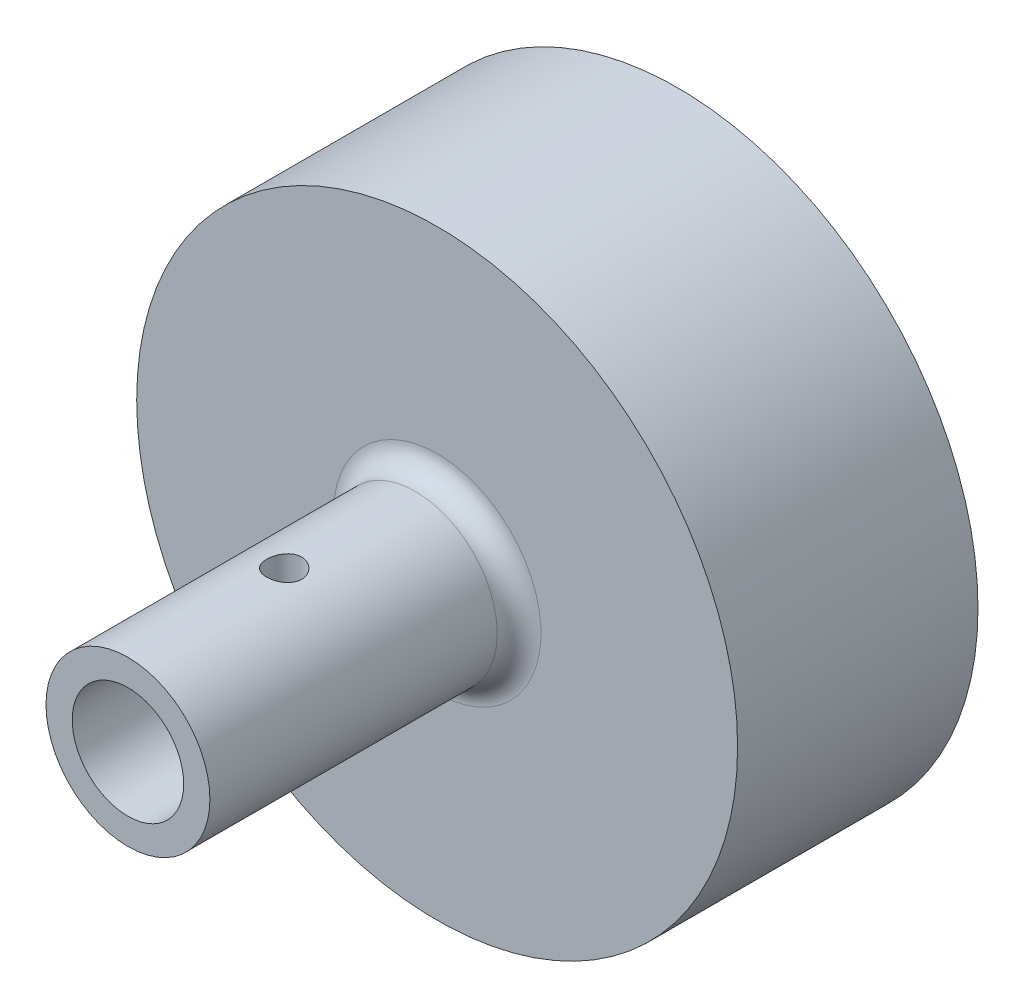
ISO-10303-21;
HEADER;
FILE_DESCRIPTION(('STEP AP214'),'2;1');
FILE_NAME('part.step','',(''),(''),'','','');
FILE_SCHEMA(('AUTOMOTIVE_DESIGN { 1 0 10303 214 1 1 1 1 }'));
ENDSEC;
DATA;
#1=APPLICATION_CONTEXT('core data for automotive mechanical design processes');
#2=APPLICATION_PROTOCOL_DEFINITION('international standard','automotive_design',2000,#1);
#3=PRODUCT_CONTEXT('',#1,'mechanical');
#4=PRODUCT('Part','Part','',(#3));
#5=PRODUCT_RELATED_PRODUCT_CATEGORY('part','',(#4));
#6=PRODUCT_DEFINITION_FORMATION('','',#4);
#7=PRODUCT_DEFINITION_CONTEXT('part definition',#1,'design');
#8=PRODUCT_DEFINITION('design','',#6,#7);
#9=PRODUCT_DEFINITION_SHAPE('','',#8);
#10=(LENGTH_UNIT() NAMED_UNIT(*) SI_UNIT(.MILLI.,.METRE.));
#11=(NAMED_UNIT(*) PLANE_ANGLE_UNIT() SI_UNIT($,.RADIAN.));
#12=(NAMED_UNIT(*) SI_UNIT($,.STERADIAN.) SOLID_ANGLE_UNIT());
#13=UNCERTAINTY_MEASURE_WITH_UNIT(LENGTH_MEASURE(1.E-05),#10,'distance_accuracy_value','');
#14=(GEOMETRIC_REPRESENTATION_CONTEXT(3) GLOBAL_UNCERTAINTY_ASSIGNED_CONTEXT((#13)) GLOBAL_UNIT_ASSIGNED_CONTEXT((#10,
#11,#12)) REPRESENTATION_CONTEXT('',''));
#15=CARTESIAN_POINT('',(0.,0.,0.));
#16=DIRECTION('',(0.,0.,1.));
#17=DIRECTION('',(1.,0.,0.));
#18=AXIS2_PLACEMENT_3D('',#15,#16,#17);
#19=CARTESIAN_POINT('',(0.,0.,28.3));
#20=DIRECTION('',(0.,0.,-1.));
#21=DIRECTION('',(-1.,0.,0.));
#22=AXIS2_PLACEMENT_3D('',#19,#20,#21);
#23=CYLINDRICAL_SURFACE('',#22,7.5);
#24=CARTESIAN_POINT('',(0.,0.,2.));
#25=DIRECTION('',(0.,0.,-1.));
#26=DIRECTION('',(-1.,0.,0.));
#27=AXIS2_PLACEMENT_3D('',#24,#25,#26);
#28=CIRCLE('',#27,7.5);
#29=CARTESIAN_POINT('',(-7.5,0.,2.));
#30=VERTEX_POINT('',#29);
#31=EDGE_CURVE('E57',#30,#30,#28,.F.);
#32=ORIENTED_EDGE('',*,*,#31,.T.);
#33=EDGE_LOOP('',(#32));
#34=FACE_BOUND('',#33,.T.);
#35=CARTESIAN_POINT('',(0.,0.,28.3));
#36=DIRECTION('',(0.,0.,1.));
#37=DIRECTION('',(1.,0.,0.));
#38=AXIS2_PLACEMENT_3D('',#35,#36,#37);
#39=CIRCLE('',#38,7.5);
#40=CARTESIAN_POINT('',(7.5,0.,28.3));
#41=VERTEX_POINT('',#40);
#42=EDGE_CURVE('E146',#41,#41,#39,.T.);
#43=ORIENTED_EDGE('',*,*,#42,.F.);
#44=EDGE_LOOP('',(#43));
#45=FACE_BOUND('',#44,.T.);
#46=CARTESIAN_POINT('',(0.,7.5,12.4));
#47=CARTESIAN_POINT('',(-0.0887944293338556,7.4999983570598,12.4000031058046));
#48=CARTESIAN_POINT('',(-0.177626889700681,7.49840703800838,12.4074166344796));
#49=CARTESIAN_POINT('',(-0.352772204992273,7.49221258982039,12.436846238572));
#50=CARTESIAN_POINT('',(-0.439083150622767,7.48760723719598,12.4588730945767));
#51=CARTESIAN_POINT('',(-0.60662858018066,7.47589793294748,12.5168109519539));
#52=CARTESIAN_POINT('',(-0.687868139445261,7.46879652810656,12.5527078051214));
#53=CARTESIAN_POINT('',(-0.843167757727072,7.45286320133509,12.6373226076027));
#54=CARTESIAN_POINT('',(-0.91722807340792,7.4440313413038,12.6860400983369));
#55=CARTESIAN_POINT('',(-1.05720419368928,7.42545480782523,12.7957028304654));
#56=CARTESIAN_POINT('',(-1.12299434543086,7.41569927510424,12.8568066331031));
#57=CARTESIAN_POINT('',(-1.24347351522622,7.39645215099328,12.989166936086));
#58=CARTESIAN_POINT('',(-1.29816158128342,7.38696058229821,13.0604243062022));
#59=CARTESIAN_POINT('',(-1.39543277767187,7.36920930951561,13.2119905950599));
#60=CARTESIAN_POINT('',(-1.43788322502763,7.36096353805546,13.2923864433165));
#61=CARTESIAN_POINT('',(-1.50862340101052,7.34679287525929,13.4593753168985));
#62=CARTESIAN_POINT('',(-1.53691473453874,7.34086772090353,13.5459676385966));
#63=CARTESIAN_POINT('',(-1.5781204953587,7.33211955105285,13.7215316191103));
#64=CARTESIAN_POINT('',(-1.59125680705956,7.32925182047022,13.810448925408));
#65=CARTESIAN_POINT('',(-1.60246934089929,7.32680881403605,13.9892680441507));
#66=CARTESIAN_POINT('',(-1.60054732105774,7.32723315384412,14.0791697404472));
#67=CARTESIAN_POINT('',(-1.58187655808685,7.33128581769295,14.2557639555169));
#68=CARTESIAN_POINT('',(-1.56538455643806,7.33485865843677,14.3424850841123));
#69=CARTESIAN_POINT('',(-1.51844828834833,7.34471814062502,14.5119006516983));
#70=CARTESIAN_POINT('',(-1.48800327344863,7.35100492764819,14.5945948744169));
#71=CARTESIAN_POINT('',(-1.41378668233803,7.36563922179753,14.7543363734402));
#72=CARTESIAN_POINT('',(-1.36991548636568,7.37400204199821,14.8313359047914));
#73=CARTESIAN_POINT('',(-1.27016199217251,7.39183660364213,14.9769757132288));
#74=CARTESIAN_POINT('',(-1.21427813244002,7.40130848917848,15.0456149017451));
#75=CARTESIAN_POINT('',(-1.09072196751541,7.4205326849195,15.1740647539185));
#76=CARTESIAN_POINT('',(-1.02283110172082,7.43028675890513,15.2336651178638));
#77=CARTESIAN_POINT('',(-0.877908758701802,7.44879883076769,15.3406674136875));
#78=CARTESIAN_POINT('',(-0.800877131200498,7.45755681226393,15.3880691449759));
#79=CARTESIAN_POINT('',(-0.639610081827262,7.4731161994162,15.4693766750074));
#80=CARTESIAN_POINT('',(-0.555360898326549,7.47991375438739,15.503255962282));
#81=CARTESIAN_POINT('',(-0.382188547319414,7.49075760800742,15.5563193412043));
#82=CARTESIAN_POINT('',(-0.293266027489786,7.49480428682212,15.5755054634659));
#83=CARTESIAN_POINT('',(-0.115076046551737,7.49963667143352,15.5983344301839));
#84=CARTESIAN_POINT('',(-0.0258469966592105,7.50048267119555,15.602264699686));
#85=CARTESIAN_POINT('',(0.151992686527999,7.49898689492793,15.5952479687875));
#86=CARTESIAN_POINT('',(0.240603359252846,7.49664532405204,15.5843019258344));
#87=CARTESIAN_POINT('',(0.413746062380252,7.48907546339841,15.5480817747837));
#88=CARTESIAN_POINT('',(0.498310863335301,7.48387736587364,15.5229574514748));
#89=CARTESIAN_POINT('',(0.662026395792984,7.47117587533623,15.4592594161198));
#90=CARTESIAN_POINT('',(0.741176681186478,7.46367229265062,15.4206845974621));
#91=CARTESIAN_POINT('',(0.893011950773004,7.44704294085318,15.3305749253818));
#92=CARTESIAN_POINT('',(0.96559365973848,7.43789638159133,15.2788699734852));
#93=CARTESIAN_POINT('',(1.10115356003048,7.41903990869546,15.1641928439698));
#94=CARTESIAN_POINT('',(1.16413056725132,7.40932992580373,15.1012192791882));
#95=CARTESIAN_POINT('',(1.27982177561402,7.39023419815026,14.9644765603723));
#96=CARTESIAN_POINT('',(1.33233743532724,7.38085708289827,14.8905380065919));
#97=CARTESIAN_POINT('',(1.42420609305472,7.36368318738415,14.7347212884883));
#98=CARTESIAN_POINT('',(1.46355965021716,7.35588633999514,14.6528434616295));
#99=CARTESIAN_POINT('',(1.52772807228231,7.3428278116798,14.4839054249434));
#100=CARTESIAN_POINT('',(1.55262307368944,7.33755218632522,14.3968767842295));
#101=CARTESIAN_POINT('',(1.58740514879098,7.33010689029808,14.2197452741203));
#102=CARTESIAN_POINT('',(1.59729448874882,7.32793675061545,14.129642871049));
#103=CARTESIAN_POINT('',(1.60169174862619,7.32697666157729,13.9509207427231));
#104=CARTESIAN_POINT('',(1.59651412882043,7.32811760571581,13.8623089794438));
#105=CARTESIAN_POINT('',(1.57162478005708,7.33349539816058,13.6872513974479));
#106=CARTESIAN_POINT('',(1.55191320540032,7.33773221359929,13.6008055557466));
#107=CARTESIAN_POINT('',(1.49866402761734,7.34879149338567,13.4327687553766));
#108=CARTESIAN_POINT('',(1.46517005919756,7.35560579203591,13.3511633964657));
#109=CARTESIAN_POINT('',(1.38534516691845,7.37105584436333,13.1946829163087));
#110=CARTESIAN_POINT('',(1.33901298148491,7.37969177702726,13.1198084574469));
#111=CARTESIAN_POINT('',(1.23377464987916,7.39801997202294,12.9773603225505));
#112=CARTESIAN_POINT('',(1.17464349733653,7.40772937703983,12.9099550517466));
#113=CARTESIAN_POINT('',(1.0459443480745,7.42699305436863,12.7859204678569));
#114=CARTESIAN_POINT('',(0.976373947694454,7.43654729038956,12.7292936433627));
#115=CARTESIAN_POINT('',(0.827748193968452,7.4545622712928,12.6277639605432));
#116=CARTESIAN_POINT('',(0.748587403501145,7.46300824065792,12.5830126901089));
#117=CARTESIAN_POINT('',(0.583706040029167,7.47770774713458,12.5075210014434));
#118=CARTESIAN_POINT('',(0.497991165498193,7.48396316300769,12.4767685700709));
#119=CARTESIAN_POINT('',(0.34346476310391,7.49243099511991,12.4357702370862));
#120=CARTESIAN_POINT('',(0.275502835649662,7.4952520823403,12.4223814853487));
#121=CARTESIAN_POINT('',(0.138368271279889,7.49903718747764,12.4044953360015));
#122=CARTESIAN_POINT('',(0.0691956833185954,7.5000012803097,12.3999975797099));
#123=CARTESIAN_POINT('',(0.,7.5,12.4));
#124=B_SPLINE_CURVE_WITH_KNOTS('',3,(#46,#47,#48,#49,#50,#51,#52,#53,#54,#55,#56,#57,#58,#59,
#60,#61,#62,#63,#64,#65,#66,#67,#68,#69,#70,#71,#72,#73,#74,#75,#76,#77,#78,#79,#80,#81,#82,#83,
#84,#85,#86,#87,#88,#89,#90,#91,#92,#93,#94,#95,#96,#97,#98,#99,#100,#101,#102,#103,#104,#105,
#106,#107,#108,#109,#110,#111,#112,#113,#114,#115,#116,#117,#118,#119,#120,#121,#122,#123),
.UNSPECIFIED.,.T.,.F.,(4,2,2,2,2,2,2,2,2,2,2,2,2,2,2,2,2,2,2,2,2,2,2,2,2,2,2,2,2,2,2,2,2,2,2,2,
2,2,4),(0.,0.266130047854764,0.532456644597193,0.798512286868046,1.0645584139285,
1.33425388789939,1.60397247832158,1.87651399120587,2.14902460517277,2.41749263134366,
2.68592931506412,2.94972810159234,3.21354104030559,3.47936093436643,3.74521540295248,
4.01653060252533,4.28785026321978,4.55969927797482,4.83151071607125,5.09817555204362,
5.36482322613615,5.62870529395039,5.89260907723844,6.16012360036749,6.42767107713311,
6.69989324302713,6.97210384299803,7.24279095265699,7.51343717712195,7.77847555890145,
8.04351112692156,8.30771397733336,8.57194279940304,8.84126112654219,9.11064156026671,
9.38331104903345,9.65574610257701,9.86314417471904,10.0705338798061),.UNSPECIFIED.);
#125=CARTESIAN_POINT('',(0.,7.5,12.4));
#126=VERTEX_POINT('',#125);
#127=EDGE_CURVE('E94',#126,#126,#124,.T.);
#128=ORIENTED_EDGE('',*,*,#127,.F.);
#129=EDGE_LOOP('',(#128));
#130=FACE_BOUND('',#129,.T.);
#131=ADVANCED_FACE('F47',(#34,#45,#130),#23,.T.);
#132=CARTESIAN_POINT('',(0.,0.,28.3));
#133=DIRECTION('',(0.,0.,-1.));
#134=DIRECTION('',(-1.,0.,0.));
#135=AXIS2_PLACEMENT_3D('',#132,#133,#134);
#136=CYLINDRICAL_SURFACE('',#135,5.1);
#137=CARTESIAN_POINT('',(0.,0.,28.3));
#138=DIRECTION('',(0.,0.,1.));
#139=DIRECTION('',(1.,0.,0.));
#140=AXIS2_PLACEMENT_3D('',#137,#138,#139);
#141=CIRCLE('',#140,5.1);
#142=CARTESIAN_POINT('',(5.1,0.,28.3));
#143=VERTEX_POINT('',#142);
#144=EDGE_CURVE('E82',#143,#143,#141,.T.);
#145=ORIENTED_EDGE('',*,*,#144,.T.);
#146=EDGE_LOOP('',(#145));
#147=FACE_BOUND('',#146,.T.);
#148=CARTESIAN_POINT('',(0.,0.,20.));
#149=DIRECTION('',(0.,0.,1.));
#150=DIRECTION('',(1.,0.,0.));
#151=AXIS2_PLACEMENT_3D('',#148,#149,#150);
#152=CIRCLE('',#151,5.1);
#153=CARTESIAN_POINT('',(3.16385840391127,4.,20.));
#154=VERTEX_POINT('',#153);
#155=CARTESIAN_POINT('',(-3.16385840391127,4.,20.));
#156=VERTEX_POINT('',#155);
#157=EDGE_CURVE('E69',#154,#156,#152,.T.);
#158=ORIENTED_EDGE('',*,*,#157,.F.);
#159=DIRECTION('',(0.,0.,-1.));
#160=VECTOR('',#159,1.);
#161=CARTESIAN_POINT('',(3.16385840391127,4.,20.));
#162=LINE('',#161,#160);
#163=CARTESIAN_POINT('',(3.16385840391127,4.,0.));
#164=VERTEX_POINT('',#163);
#165=EDGE_CURVE('E86',#154,#164,#162,.T.);
#166=ORIENTED_EDGE('',*,*,#165,.T.);
#167=CARTESIAN_POINT('',(0.,0.,0.));
#168=DIRECTION('',(0.,0.,1.));
#169=DIRECTION('',(1.,0.,0.));
#170=AXIS2_PLACEMENT_3D('',#167,#168,#169);
#171=CIRCLE('',#170,5.1);
#172=CARTESIAN_POINT('',(-3.16385840391127,4.,0.));
#173=VERTEX_POINT('',#172);
#174=EDGE_CURVE('E77',#173,#164,#171,.T.);
#175=ORIENTED_EDGE('',*,*,#174,.F.);
#176=DIRECTION('',(0.,0.,-1.));
#177=VECTOR('',#176,1.);
#178=CARTESIAN_POINT('',(-3.16385840391127,4.,20.));
#179=LINE('',#178,#177);
#180=EDGE_CURVE('E64',#156,#173,#179,.T.);
#181=ORIENTED_EDGE('',*,*,#180,.F.);
#182=EDGE_LOOP('',(#158,#166,#175,#181));
#183=FACE_BOUND('',#182,.T.);
#184=ADVANCED_FACE('F87',(#147,#183),#136,.F.);
#185=CARTESIAN_POINT('',(0.,0.,0.));
#186=DIRECTION('',(0.,0.,-1.));
#187=DIRECTION('',(-1.,0.,0.));
#188=AXIS2_PLACEMENT_3D('',#185,#186,#187);
#189=PLANE('',#188);
#190=DIRECTION('',(1.,0.,0.));
#191=VECTOR('',#190,1.);
#192=CARTESIAN_POINT('',(0.,4.,0.));
#193=LINE('',#192,#191);
#194=EDGE_CURVE('E80',#173,#164,#193,.T.);
#195=ORIENTED_EDGE('',*,*,#194,.F.);
#196=ORIENTED_EDGE('',*,*,#174,.T.);
#197=EDGE_LOOP('',(#195,#196));
#198=FACE_BOUND('',#197,.T.);
#199=ADVANCED_FACE('F78',(#198),#189,.F.);
#200=CARTESIAN_POINT('',(0.,0.,28.3));
#201=DIRECTION('',(0.,0.,1.));
#202=DIRECTION('',(1.,0.,0.));
#203=AXIS2_PLACEMENT_3D('',#200,#201,#202);
#204=PLANE('',#203);
#205=ORIENTED_EDGE('',*,*,#42,.T.);
#206=EDGE_LOOP('',(#205));
#207=FACE_BOUND('',#206,.T.);
#208=ORIENTED_EDGE('',*,*,#144,.F.);
#209=EDGE_LOOP('',(#208));
#210=FACE_BOUND('',#209,.T.);
#211=ADVANCED_FACE('F183',(#207,#210),#204,.T.);
#212=CARTESIAN_POINT('',(0.,0.,-22.));
#213=DIRECTION('',(0.,0.,1.));
#214=DIRECTION('',(1.,0.,0.));
#215=AXIS2_PLACEMENT_3D('',#212,#213,#214);
#216=CYLINDRICAL_SURFACE('',#215,27.5);
#217=CARTESIAN_POINT('',(0.,0.,-22.));
#218=DIRECTION('',(0.,0.,-1.));
#219=DIRECTION('',(-1.,0.,0.));
#220=AXIS2_PLACEMENT_3D('',#217,#218,#219);
#221=CIRCLE('',#220,27.5);
#222=CARTESIAN_POINT('',(-27.5,0.,-22.));
#223=VERTEX_POINT('',#222);
#224=EDGE_CURVE('E83',#223,#223,#221,.T.);
#225=ORIENTED_EDGE('',*,*,#224,.F.);
#226=EDGE_LOOP('',(#225));
#227=FACE_BOUND('',#226,.T.);
#228=CARTESIAN_POINT('',(0.,0.,0.));
#229=DIRECTION('',(0.,0.,-1.));
#230=DIRECTION('',(-1.,0.,0.));
#231=AXIS2_PLACEMENT_3D('',#228,#229,#230);
#232=CIRCLE('',#231,27.5);
#233=CARTESIAN_POINT('',(-27.5,0.,0.));
#234=VERTEX_POINT('',#233);
#235=EDGE_CURVE('E110',#234,#234,#232,.T.);
#236=ORIENTED_EDGE('',*,*,#235,.T.);
#237=EDGE_LOOP('',(#236));
#238=FACE_BOUND('',#237,.T.);
#239=ADVANCED_FACE('F225',(#227,#238),#216,.T.);
#240=CARTESIAN_POINT('',(0.,0.,-22.));
#241=DIRECTION('',(0.,0.,-1.));
#242=DIRECTION('',(-1.,0.,0.));
#243=AXIS2_PLACEMENT_3D('',#240,#241,#242);
#244=PLANE('',#243);
#245=CARTESIAN_POINT('',(0.,12.,-22.));
#246=DIRECTION('',(0.,0.,-1.));
#247=DIRECTION('',(-1.,0.,0.));
#248=AXIS2_PLACEMENT_3D('',#245,#246,#247);
#249=CIRCLE('',#248,2.125);
#250=CARTESIAN_POINT('',(-2.125,12.,-22.));
#251=VERTEX_POINT('',#250);
#252=EDGE_CURVE('E111',#251,#251,#249,.T.);
#253=ORIENTED_EDGE('',*,*,#252,.F.);
#254=EDGE_LOOP('',(#253));
#255=FACE_BOUND('',#254,.T.);
#256=CARTESIAN_POINT('',(-12.,0.,-22.));
#257=DIRECTION('',(0.,0.,-1.));
#258=DIRECTION('',(-1.,0.,0.));
#259=AXIS2_PLACEMENT_3D('',#256,#257,#258);
#260=CIRCLE('',#259,2.125);
#261=CARTESIAN_POINT('',(-14.125,0.,-22.));
#262=VERTEX_POINT('',#261);
#263=EDGE_CURVE('E115',#262,#262,#260,.T.);
#264=ORIENTED_EDGE('',*,*,#263,.F.);
#265=EDGE_LOOP('',(#264));
#266=FACE_BOUND('',#265,.T.);
#267=CARTESIAN_POINT('',(0.,-12.,-22.));
#268=DIRECTION('',(0.,0.,-1.));
#269=DIRECTION('',(-1.,0.,0.));
#270=AXIS2_PLACEMENT_3D('',#267,#268,#269);
#271=CIRCLE('',#270,2.125);
#272=CARTESIAN_POINT('',(-2.12499999999992,-12.,-22.));
#273=VERTEX_POINT('',#272);
#274=EDGE_CURVE('E123',#273,#273,#271,.T.);
#275=ORIENTED_EDGE('',*,*,#274,.F.);
#276=EDGE_LOOP('',(#275));
#277=FACE_BOUND('',#276,.T.);
#278=CARTESIAN_POINT('',(12.,1.25693328198353E-13,-22.));
#279=DIRECTION('',(0.,0.,-1.));
#280=DIRECTION('',(-1.,0.,0.));
#281=AXIS2_PLACEMENT_3D('',#278,#279,#280);
#282=CIRCLE('',#281,2.125);
#283=CARTESIAN_POINT('',(9.875,1.25693328198353E-13,-22.));
#284=VERTEX_POINT('',#283);
#285=EDGE_CURVE('E131',#284,#284,#282,.T.);
#286=ORIENTED_EDGE('',*,*,#285,.F.);
#287=EDGE_LOOP('',(#286));
#288=FACE_BOUND('',#287,.T.);
#289=ORIENTED_EDGE('',*,*,#224,.T.);
#290=EDGE_LOOP('',(#289));
#291=FACE_BOUND('',#290,.T.);
#292=ADVANCED_FACE('F169',(#255,#266,#277,#288,#291),#244,.T.);
#293=CARTESIAN_POINT('',(0.,0.,0.));
#294=DIRECTION('',(0.,0.,-1.));
#295=DIRECTION('',(-1.,0.,0.));
#296=AXIS2_PLACEMENT_3D('',#293,#294,#295);
#297=CIRCLE('',#296,9.5);
#298=CARTESIAN_POINT('',(-9.5,0.,0.));
#299=VERTEX_POINT('',#298);
#300=EDGE_CURVE('E11',#299,#299,#297,.T.);
#301=ORIENTED_EDGE('',*,*,#300,.T.);
#302=EDGE_LOOP('',(#301));
#303=FACE_BOUND('',#302,.T.);
#304=ORIENTED_EDGE('',*,*,#235,.F.);
#305=EDGE_LOOP('',(#304));
#306=FACE_BOUND('',#305,.T.);
#307=ADVANCED_FACE('F159',(#303,#306),#189,.F.);
#308=CARTESIAN_POINT('',(0.,0.,2.));
#309=DIRECTION('',(0.,0.,-1.));
#310=DIRECTION('',(-1.,0.,0.));
#311=AXIS2_PLACEMENT_3D('',#308,#309,#310);
#312=TOROIDAL_SURFACE('',#311,9.5,2.);
#313=ORIENTED_EDGE('',*,*,#300,.F.);
#314=EDGE_LOOP('',(#313));
#315=FACE_BOUND('',#314,.T.);
#316=ORIENTED_EDGE('',*,*,#31,.F.);
#317=EDGE_LOOP('',(#316));
#318=FACE_BOUND('',#317,.T.);
#319=ADVANCED_FACE('F49',(#315,#318),#312,.F.);
#320=CARTESIAN_POINT('',(12.,1.25693328198353E-13,-2.));
#321=DIRECTION('',(0.,0.,-1.));
#322=DIRECTION('',(-1.,0.,0.));
#323=AXIS2_PLACEMENT_3D('',#320,#321,#322);
#324=CYLINDRICAL_SURFACE('',#323,2.125);
#325=CARTESIAN_POINT('',(12.,1.25693328198353E-13,-2.));
#326=DIRECTION('',(0.,0.,-1.));
#327=DIRECTION('',(-1.,0.,0.));
#328=AXIS2_PLACEMENT_3D('',#325,#326,#327);
#329=CIRCLE('',#328,2.125);
#330=CARTESIAN_POINT('',(9.875,1.25693328198353E-13,-2.));
#331=VERTEX_POINT('',#330);
#332=EDGE_CURVE('E105',#331,#331,#329,.T.);
#333=ORIENTED_EDGE('',*,*,#332,.F.);
#334=EDGE_LOOP('',(#333));
#335=FACE_BOUND('',#334,.T.);
#336=ORIENTED_EDGE('',*,*,#285,.T.);
#337=EDGE_LOOP('',(#336));
#338=FACE_BOUND('',#337,.T.);
#339=ADVANCED_FACE('F158',(#335,#338),#324,.F.);
#340=CARTESIAN_POINT('',(12.,1.25693328198353E-13,-2.));
#341=DIRECTION('',(0.,0.,-1.));
#342=DIRECTION('',(-1.,0.,0.));
#343=AXIS2_PLACEMENT_3D('',#340,#341,#342);
#344=PLANE('',#343);
#345=ORIENTED_EDGE('',*,*,#332,.T.);
#346=EDGE_LOOP('',(#345));
#347=FACE_BOUND('',#346,.T.);
#348=ADVANCED_FACE('F166',(#347),#344,.T.);
#349=CARTESIAN_POINT('',(0.,-12.,-2.));
#350=DIRECTION('',(0.,0.,-1.));
#351=DIRECTION('',(-1.,0.,0.));
#352=AXIS2_PLACEMENT_3D('',#349,#350,#351);
#353=CYLINDRICAL_SURFACE('',#352,2.125);
#354=CARTESIAN_POINT('',(0.,-12.,-2.));
#355=DIRECTION('',(0.,0.,-1.));
#356=DIRECTION('',(-1.,0.,0.));
#357=AXIS2_PLACEMENT_3D('',#354,#355,#356);
#358=CIRCLE('',#357,2.125);
#359=CARTESIAN_POINT('',(-2.12499999999992,-12.,-2.));
#360=VERTEX_POINT('',#359);
#361=EDGE_CURVE('E127',#360,#360,#358,.T.);
#362=ORIENTED_EDGE('',*,*,#361,.F.);
#363=EDGE_LOOP('',(#362));
#364=FACE_BOUND('',#363,.T.);
#365=ORIENTED_EDGE('',*,*,#274,.T.);
#366=EDGE_LOOP('',(#365));
#367=FACE_BOUND('',#366,.T.);
#368=ADVANCED_FACE('F215',(#364,#367),#353,.F.);
#369=CARTESIAN_POINT('',(0.,-12.,-2.));
#370=DIRECTION('',(0.,0.,-1.));
#371=DIRECTION('',(-1.,0.,0.));
#372=AXIS2_PLACEMENT_3D('',#369,#370,#371);
#373=PLANE('',#372);
#374=ORIENTED_EDGE('',*,*,#361,.T.);
#375=EDGE_LOOP('',(#374));
#376=FACE_BOUND('',#375,.T.);
#377=ADVANCED_FACE('F210',(#376),#373,.T.);
#378=CARTESIAN_POINT('',(-12.,0.,-2.));
#379=DIRECTION('',(0.,0.,-1.));
#380=DIRECTION('',(-1.,0.,0.));
#381=AXIS2_PLACEMENT_3D('',#378,#379,#380);
#382=CYLINDRICAL_SURFACE('',#381,2.125);
#383=CARTESIAN_POINT('',(-12.,0.,-2.));
#384=DIRECTION('',(0.,0.,-1.));
#385=DIRECTION('',(-1.,0.,0.));
#386=AXIS2_PLACEMENT_3D('',#383,#384,#385);
#387=CIRCLE('',#386,2.125);
#388=CARTESIAN_POINT('',(-14.125,0.,-2.));
#389=VERTEX_POINT('',#388);
#390=EDGE_CURVE('E119',#389,#389,#387,.T.);
#391=ORIENTED_EDGE('',*,*,#390,.F.);
#392=EDGE_LOOP('',(#391));
#393=FACE_BOUND('',#392,.T.);
#394=ORIENTED_EDGE('',*,*,#263,.T.);
#395=EDGE_LOOP('',(#394));
#396=FACE_BOUND('',#395,.T.);
#397=ADVANCED_FACE('F207',(#393,#396),#382,.F.);
#398=CARTESIAN_POINT('',(-12.,0.,-2.));
#399=DIRECTION('',(0.,0.,-1.));
#400=DIRECTION('',(-1.,0.,0.));
#401=AXIS2_PLACEMENT_3D('',#398,#399,#400);
#402=PLANE('',#401);
#403=ORIENTED_EDGE('',*,*,#390,.T.);
#404=EDGE_LOOP('',(#403));
#405=FACE_BOUND('',#404,.T.);
#406=ADVANCED_FACE('F205',(#405),#402,.T.);
#407=CARTESIAN_POINT('',(0.,12.,-2.));
#408=DIRECTION('',(0.,0.,-1.));
#409=DIRECTION('',(-1.,0.,0.));
#410=AXIS2_PLACEMENT_3D('',#407,#408,#409);
#411=CYLINDRICAL_SURFACE('',#410,2.125);
#412=CARTESIAN_POINT('',(0.,12.,-2.));
#413=DIRECTION('',(0.,0.,-1.));
#414=DIRECTION('',(-1.,0.,0.));
#415=AXIS2_PLACEMENT_3D('',#412,#413,#414);
#416=CIRCLE('',#415,2.125);
#417=CARTESIAN_POINT('',(-2.125,12.,-2.));
#418=VERTEX_POINT('',#417);
#419=EDGE_CURVE('E106',#418,#418,#416,.T.);
#420=ORIENTED_EDGE('',*,*,#419,.F.);
#421=EDGE_LOOP('',(#420));
#422=FACE_BOUND('',#421,.T.);
#423=ORIENTED_EDGE('',*,*,#252,.T.);
#424=EDGE_LOOP('',(#423));
#425=FACE_BOUND('',#424,.T.);
#426=ADVANCED_FACE('F201',(#422,#425),#411,.F.);
#427=CARTESIAN_POINT('',(0.,12.,-2.));
#428=DIRECTION('',(0.,0.,-1.));
#429=DIRECTION('',(-1.,0.,0.));
#430=AXIS2_PLACEMENT_3D('',#427,#428,#429);
#431=PLANE('',#430);
#432=ORIENTED_EDGE('',*,*,#419,.T.);
#433=EDGE_LOOP('',(#432));
#434=FACE_BOUND('',#433,.T.);
#435=ADVANCED_FACE('F197',(#434),#431,.T.);
#436=CARTESIAN_POINT('',(0.,4.,20.));
#437=DIRECTION('',(0.,1.,0.));
#438=DIRECTION('',(0.,0.,1.));
#439=AXIS2_PLACEMENT_3D('',#436,#437,#438);
#440=PLANE('',#439);
#441=CARTESIAN_POINT('',(0.,4.,14.));
#442=DIRECTION('',(0.,1.,0.));
#443=DIRECTION('',(0.,0.,1.));
#444=AXIS2_PLACEMENT_3D('',#441,#442,#443);
#445=CIRCLE('',#444,1.6);
#446=CARTESIAN_POINT('',(0.,4.,15.6));
#447=VERTEX_POINT('',#446);
#448=EDGE_CURVE('E51',#447,#447,#445,.F.);
#449=ORIENTED_EDGE('',*,*,#448,.F.);
#450=EDGE_LOOP('',(#449));
#451=FACE_BOUND('',#450,.T.);
#452=ORIENTED_EDGE('',*,*,#194,.T.);
#453=ORIENTED_EDGE('',*,*,#165,.F.);
#454=DIRECTION('',(1.,0.,0.));
#455=VECTOR('',#454,1.);
#456=CARTESIAN_POINT('',(0.,4.,20.));
#457=LINE('',#456,#455);
#458=EDGE_CURVE('E90',#156,#154,#457,.T.);
#459=ORIENTED_EDGE('',*,*,#458,.F.);
#460=ORIENTED_EDGE('',*,*,#180,.T.);
#461=EDGE_LOOP('',(#452,#453,#459,#460));
#462=FACE_BOUND('',#461,.T.);
#463=ADVANCED_FACE('F92',(#451,#462),#440,.F.);
#464=CARTESIAN_POINT('',(0.,0.,20.));
#465=DIRECTION('',(0.,0.,1.));
#466=DIRECTION('',(1.,0.,0.));
#467=AXIS2_PLACEMENT_3D('',#464,#465,#466);
#468=PLANE('',#467);
#469=ORIENTED_EDGE('',*,*,#157,.T.);
#470=ORIENTED_EDGE('',*,*,#458,.T.);
#471=EDGE_LOOP('',(#469,#470));
#472=FACE_BOUND('',#471,.T.);
#473=ADVANCED_FACE('F192',(#472),#468,.T.);
#474=CARTESIAN_POINT('',(0.,15.,14.));
#475=DIRECTION('',(0.,-1.,0.));
#476=DIRECTION('',(0.,0.,-1.));
#477=AXIS2_PLACEMENT_3D('',#474,#475,#476);
#478=CYLINDRICAL_SURFACE('',#477,1.6);
#479=ORIENTED_EDGE('',*,*,#448,.T.);
#480=EDGE_LOOP('',(#479));
#481=FACE_BOUND('',#480,.T.);
#482=ORIENTED_EDGE('',*,*,#127,.T.);
#483=EDGE_LOOP('',(#482));
#484=FACE_BOUND('',#483,.T.);
#485=ADVANCED_FACE('F188',(#481,#484),#478,.F.);
#486=CLOSED_SHELL('',(#131,#184,#199,#211,#239,#292,#307,#319,#339,#348,#368,#377,#397,#406,
#426,#435,#463,#473,#485));
#487=MANIFOLD_SOLID_BREP('B2',#486);
#488=ADVANCED_BREP_SHAPE_REPRESENTATION('',(#18,#487),#14);
#489=SHAPE_DEFINITION_REPRESENTATION(#9,#488);
ENDSEC;
END-ISO-10303-21;
